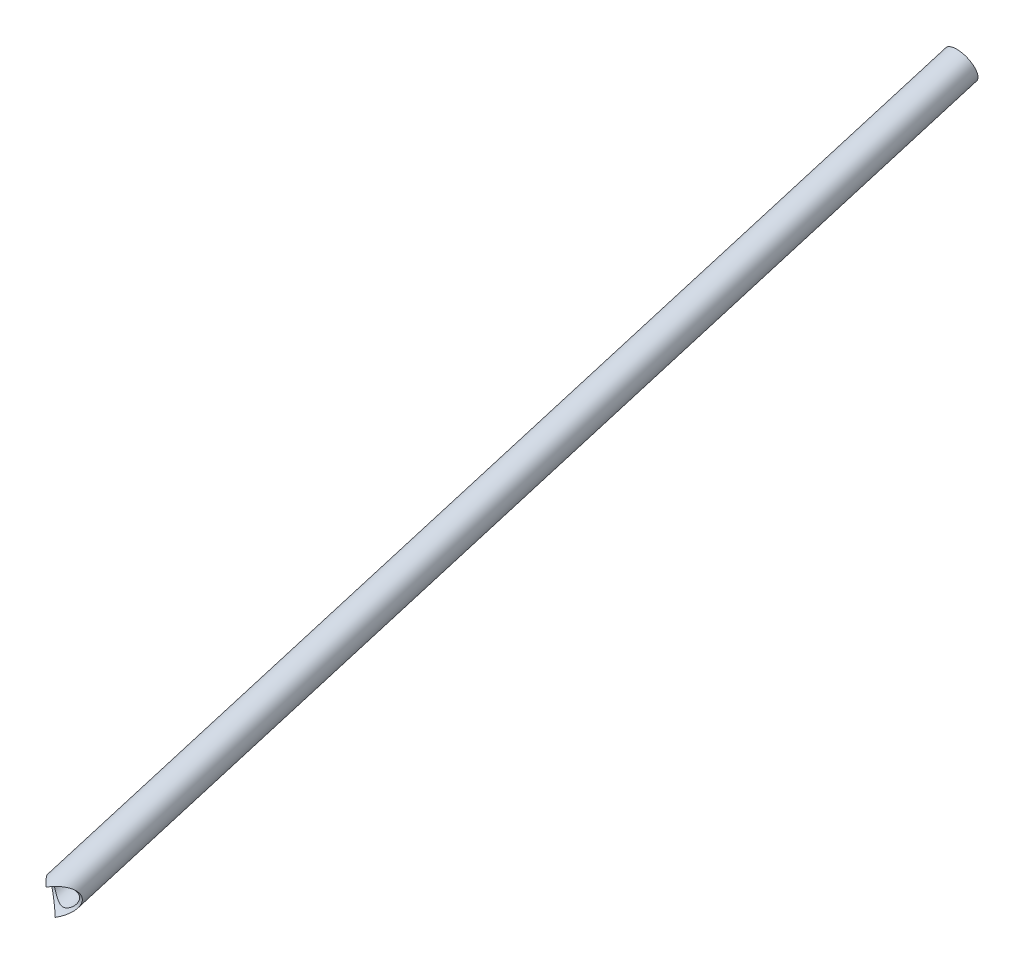
ISO-10303-21;
HEADER;
FILE_DESCRIPTION(('STEP AP214'),'2;1');
FILE_NAME('part.step','',(''),(''),'','','');
FILE_SCHEMA(('AUTOMOTIVE_DESIGN { 1 0 10303 214 1 1 1 1 }'));
ENDSEC;
DATA;
#1=APPLICATION_CONTEXT('core data for automotive mechanical design processes');
#2=APPLICATION_PROTOCOL_DEFINITION('international standard','automotive_design',2000,#1);
#3=PRODUCT_CONTEXT('',#1,'mechanical');
#4=PRODUCT('Part','Part','',(#3));
#5=PRODUCT_RELATED_PRODUCT_CATEGORY('part','',(#4));
#6=PRODUCT_DEFINITION_FORMATION('','',#4);
#7=PRODUCT_DEFINITION_CONTEXT('part definition',#1,'design');
#8=PRODUCT_DEFINITION('design','',#6,#7);
#9=PRODUCT_DEFINITION_SHAPE('','',#8);
#10=(LENGTH_UNIT() NAMED_UNIT(*) SI_UNIT(.MILLI.,.METRE.));
#11=(NAMED_UNIT(*) PLANE_ANGLE_UNIT() SI_UNIT($,.RADIAN.));
#12=(NAMED_UNIT(*) SI_UNIT($,.STERADIAN.) SOLID_ANGLE_UNIT());
#13=UNCERTAINTY_MEASURE_WITH_UNIT(LENGTH_MEASURE(1.E-05),#10,'distance_accuracy_value','');
#14=(GEOMETRIC_REPRESENTATION_CONTEXT(3) GLOBAL_UNCERTAINTY_ASSIGNED_CONTEXT((#13)) GLOBAL_UNIT_ASSIGNED_CONTEXT((#10,
#11,#12)) REPRESENTATION_CONTEXT('',''));
#15=CARTESIAN_POINT('',(0.,0.,0.));
#16=DIRECTION('',(0.,0.,1.));
#17=DIRECTION('',(1.,0.,0.));
#18=AXIS2_PLACEMENT_3D('',#15,#16,#17);
#19=CARTESIAN_POINT('',(0.,380.,-601.037933611912));
#20=DIRECTION('',(0.,0.28459115578957,-0.958648983750756));
#21=DIRECTION('',(0.,0.958648983750756,0.28459115578957));
#22=AXIS2_PLACEMENT_3D('',#19,#20,#21);
#23=CYLINDRICAL_SURFACE('',#22,7.9);
#24=CARTESIAN_POINT('',(0.,540.,-1140.));
#25=DIRECTION('',(0.,-0.28459115578957,0.958648983750756));
#26=DIRECTION('',(1.,0.,0.));
#27=AXIS2_PLACEMENT_3D('',#24,#25,#26);
#28=CIRCLE('',#27,7.9);
#29=CARTESIAN_POINT('',(7.90000000000003,540.,-1140.));
#30=VERTEX_POINT('',#29);
#31=EDGE_CURVE('E78',#30,#30,#28,.T.);
#32=ORIENTED_EDGE('',*,*,#31,.F.);
#33=EDGE_LOOP('',(#32));
#34=FACE_BOUND('',#33,.T.);
#35=CARTESIAN_POINT('',(0.,389.074933040662,-603.847842917835));
#36=CARTESIAN_POINT('',(-0.140198705166132,389.074933218041,-603.847840771808));
#37=CARTESIAN_POINT('',(-0.280388340726457,389.072944604983,-603.854288645852));
#38=CARTESIAN_POINT('',(-0.559491933208422,389.065003416711,-603.879744498527));
#39=CARTESIAN_POINT('',(-0.698405940657576,389.059050999195,-603.898751977478));
#40=CARTESIAN_POINT('',(-0.9742319801172,389.043192715734,-603.948490511685));
#41=CARTESIAN_POINT('',(-1.1111379818681,389.033276775466,-603.979251432512));
#42=CARTESIAN_POINT('',(-1.38184415750912,389.009524129343,-604.051222035313));
#43=CARTESIAN_POINT('',(-1.5156431382016,388.995685943302,-604.092435661333));
#44=CARTESIAN_POINT('',(-1.83055904233549,388.95801991669,-604.20153320174));
#45=CARTESIAN_POINT('',(-2.01002233988592,388.932397692391,-604.273572757181));
#46=CARTESIAN_POINT('',(-2.36153905933224,388.87366368223,-604.431334994707));
#47=CARTESIAN_POINT('',(-2.53358898873316,388.840548411283,-604.517064038422));
#48=CARTESIAN_POINT('',(-2.87071277700848,388.766650362223,-604.699289961532));
#49=CARTESIAN_POINT('',(-3.03576783451177,388.725848348891,-604.795813601485));
#50=CARTESIAN_POINT('',(-3.35865952772203,388.636475624816,-604.996899236841));
#51=CARTESIAN_POINT('',(-3.51649641276467,388.587905182676,-605.101460954251));
#52=CARTESIAN_POINT('',(-3.89326619557405,388.459604327928,-605.363993335558));
#53=CARTESIAN_POINT('',(-4.10849126450114,388.375571661216,-605.525204480512));
#54=CARTESIAN_POINT('',(-4.52507639374604,388.190086518303,-605.855444803985));
#55=CARTESIAN_POINT('',(-4.72643053660203,388.088626671201,-606.024477268372));
#56=CARTESIAN_POINT('',(-5.11493700864665,387.867496577179,-606.366530812169));
#57=CARTESIAN_POINT('',(-5.30210118205758,387.747841773865,-606.539548404373));
#58=CARTESIAN_POINT('',(-5.66167374437891,387.489378701131,-606.886521998578));
#59=CARTESIAN_POINT('',(-5.83408766897071,387.350577668721,-607.060477622257));
#60=CARTESIAN_POINT('',(-6.12818251694021,387.084449257497,-607.36983467366));
#61=CARTESIAN_POINT('',(-6.25288575762627,386.960893963894,-607.505616388007));
#62=CARTESIAN_POINT('',(-6.49148732020402,386.701057984607,-607.774457323246));
#63=CARTESIAN_POINT('',(-6.60538784055275,386.564779899384,-607.907517093738));
#64=CARTESIAN_POINT('',(-6.82121925179064,386.279506330972,-608.169218366054));
#65=CARTESIAN_POINT('',(-6.92316492074691,386.130526950758,-608.29786518071));
#66=CARTESIAN_POINT('',(-7.11403361083094,385.81978304625,-608.549260993654));
#67=CARTESIAN_POINT('',(-7.20295898327905,385.658020838537,-608.672011054133));
#68=CARTESIAN_POINT('',(-7.35239681898775,385.351043828774,-608.889389631069));
#69=CARTESIAN_POINT('',(-7.41516511272451,385.207775965109,-608.985220900528));
#70=CARTESIAN_POINT('',(-7.53012562345858,384.913193417059,-609.170633225379));
#71=CARTESIAN_POINT('',(-7.58231997250967,384.761880362632,-609.260215538371));
#72=CARTESIAN_POINT('',(-7.6754079172861,384.45188301025,-609.432106317085));
#73=CARTESIAN_POINT('',(-7.71630532585937,384.293201220503,-609.514417230593));
#74=CARTESIAN_POINT('',(-7.78619269743311,383.969290264683,-609.670840235354));
#75=CARTESIAN_POINT('',(-7.81518252312598,383.804061023135,-609.744952232057));
#76=CARTESIAN_POINT('',(-7.86086179509572,383.467448146822,-609.884409086844));
#77=CARTESIAN_POINT('',(-7.87749895930503,383.296041536809,-609.949715733945));
#78=CARTESIAN_POINT('',(-7.89797323859593,382.949040073782,-610.070480835862));
#79=CARTESIAN_POINT('',(-7.90181032698043,382.773445212033,-610.125939270138));
#80=CARTESIAN_POINT('',(-7.8966140832068,382.419512333479,-610.226502904453));
#81=CARTESIAN_POINT('',(-7.88758124894792,382.241174423058,-610.271608504933));
#82=CARTESIAN_POINT('',(-7.85681088207582,381.883240486664,-610.351204603661));
#83=CARTESIAN_POINT('',(-7.83507377871531,381.703644503401,-610.3856954605));
#84=CARTESIAN_POINT('',(-7.78114606022274,381.356655625464,-610.442097241651));
#85=CARTESIAN_POINT('',(-7.74975082382369,381.189249042516,-610.464694651477));
#86=CARTESIAN_POINT('',(-7.67667179046085,380.855655994073,-610.500808974226));
#87=CARTESIAN_POINT('',(-7.63498452249852,380.689469959721,-610.514322817972));
#88=CARTESIAN_POINT('',(-7.54188327999775,380.35940664029,-610.532571206728));
#89=CARTESIAN_POINT('',(-7.49047131361981,380.195528886043,-610.537307562123));
#90=CARTESIAN_POINT('',(-7.37849967418185,379.870848456446,-610.538443715513));
#91=CARTESIAN_POINT('',(-7.31793649158187,379.710046987638,-610.534840307541));
#92=CARTESIAN_POINT('',(-7.18271553524371,379.378624058127,-610.519163412687));
#93=CARTESIAN_POINT('',(-7.10729357629148,379.208347247821,-610.506388201741));
#94=CARTESIAN_POINT('',(-6.94718292382085,378.873068288921,-610.472363291057));
#95=CARTESIAN_POINT('',(-6.86249100159566,378.708068004149,-610.451110631785));
#96=CARTESIAN_POINT('',(-6.59559781102728,378.221893275001,-610.375798214059));
#97=CARTESIAN_POINT('',(-6.40051451646308,377.909388684674,-610.310175306684));
#98=CARTESIAN_POINT('',(-6.06437493065132,377.430032331717,-610.185620814191));
#99=CARTESIAN_POINT('',(-5.93249725847849,377.254488646048,-610.13432168274));
#100=CARTESIAN_POINT('',(-5.65883825862776,376.913684999871,-610.02440486656));
#101=CARTESIAN_POINT('',(-5.51705776702701,376.748424173423,-609.965787799344));
#102=CARTESIAN_POINT('',(-5.22393976465587,376.428435122373,-609.842669509363));
#103=CARTESIAN_POINT('',(-5.07258685943922,376.273724740336,-609.778158730212));
#104=CARTESIAN_POINT('',(-4.7608570794348,375.975627098827,-609.644969173335));
#105=CARTESIAN_POINT('',(-4.60048081212769,375.832239078656,-609.576290676168));
#106=CARTESIAN_POINT('',(-4.26879305155578,375.55574530154,-609.435726943311));
#107=CARTESIAN_POINT('',(-4.09737334894962,375.422783736193,-609.363813098693));
#108=CARTESIAN_POINT('',(-3.74516170717446,375.16993284473,-609.219719577483));
#109=CARTESIAN_POINT('',(-3.56436747522876,375.050046739007,-609.147539839908));
#110=CARTESIAN_POINT('',(-3.19337181317182,374.824838558278,-609.005704419572));
#111=CARTESIAN_POINT('',(-3.00318690795805,374.719492056531,-608.936044652205));
#112=CARTESIAN_POINT('',(-2.61290530262902,374.525026216027,-608.802504744946));
#113=CARTESIAN_POINT('',(-2.41281528580764,374.435896120375,-608.738620788017));
#114=CARTESIAN_POINT('',(-1.95639898131742,374.258459690222,-608.607574005229));
#115=CARTESIAN_POINT('',(-1.69747434733742,374.174759641194,-608.542850810268));
#116=CARTESIAN_POINT('',(-1.29944939706605,374.074753389387,-608.463784839389));
#117=CARTESIAN_POINT('',(-1.16526918497823,374.045687155952,-608.440443097719));
#118=CARTESIAN_POINT('',(-0.894241109357024,373.996759247914,-608.400819888454));
#119=CARTESIAN_POINT('',(-0.757394675082758,373.976892775854,-608.384534741298));
#120=CARTESIAN_POINT('',(-0.480501039363062,373.946817347031,-608.359775582632));
#121=CARTESIAN_POINT('',(-0.3404354203518,373.936709143083,-608.351383084072));
#122=CARTESIAN_POINT('',(-0.059688885967576,373.926864813291,-608.343210586807));
#123=CARTESIAN_POINT('',(0.0809919953120438,373.927128119836,-608.343430116784));
#124=CARTESIAN_POINT('',(0.361770200254796,373.938020724719,-608.352470876916));
#125=CARTESIAN_POINT('',(0.501867020233609,373.948657625784,-608.361298415814));
#126=CARTESIAN_POINT('',(0.780185241006483,373.979928869618,-608.387025181005));
#127=CARTESIAN_POINT('',(0.918406351387906,374.000564742757,-608.403925642874));
#128=CARTESIAN_POINT('',(1.21487363601642,374.055416507762,-608.448289064076));
#129=CARTESIAN_POINT('',(1.37261154579278,374.091324134827,-608.477044171941));
#130=CARTESIAN_POINT('',(1.68339925929195,374.174654995244,-608.542475692007));
#131=CARTESIAN_POINT('',(1.83644528097903,374.222087257061,-608.579158312167));
#132=CARTESIAN_POINT('',(2.13771707801443,374.327351297106,-608.658656100869));
#133=CARTESIAN_POINT('',(2.28592904549343,374.385210227871,-608.701487220293));
#134=CARTESIAN_POINT('',(2.57697398913313,374.510131264116,-608.791466610002));
#135=CARTESIAN_POINT('',(2.7198082467326,374.577191159211,-608.838613842505));
#136=CARTESIAN_POINT('',(3.08204037383424,374.761174299923,-608.964046847896));
#137=CARTESIAN_POINT('',(3.29752530331886,374.884374412677,-609.044461105118));
#138=CARTESIAN_POINT('',(3.71607497425997,375.149071657939,-609.207555315283));
#139=CARTESIAN_POINT('',(3.91913278510158,375.290578865791,-609.290236495936));
#140=CARTESIAN_POINT('',(4.31346966621354,375.590376724835,-609.454254820082));
#141=CARTESIAN_POINT('',(4.50473340408777,375.748688524052,-609.535590117491));
#142=CARTESIAN_POINT('',(4.87523576964812,376.080775836742,-609.693770842944));
#143=CARTESIAN_POINT('',(5.05447675654683,376.254548300721,-609.770617151473));
#144=CARTESIAN_POINT('',(5.40715910714218,376.623590018492,-609.919992213498));
#145=CARTESIAN_POINT('',(5.58012784480535,376.819422383753,-609.992249379096));
#146=CARTESIAN_POINT('',(5.91194645909232,377.22611704483,-610.126466824592));
#147=CARTESIAN_POINT('',(6.07079392191931,377.436981899144,-610.188425345677));
#148=CARTESIAN_POINT('',(6.37260703914589,377.872287480164,-610.299314312737));
#149=CARTESIAN_POINT('',(6.51560987386365,378.096694430515,-610.348275651478));
#150=CARTESIAN_POINT('',(6.78432413306596,378.558296722445,-610.430824337466));
#151=CARTESIAN_POINT('',(6.91004381567741,378.795485880564,-610.464419045083));
#152=CARTESIAN_POINT('',(7.10741180804384,379.208464233181,-610.506449244164));
#153=CARTESIAN_POINT('',(7.18399982577244,379.381452236271,-610.519401078825));
#154=CARTESIAN_POINT('',(7.32679366399491,379.732085566573,-610.535775531372));
#155=CARTESIAN_POINT('',(7.39300216803337,379.909729676075,-610.539200616174));
#156=CARTESIAN_POINT('',(7.51418711651106,380.268638604006,-610.535829346237));
#157=CARTESIAN_POINT('',(7.56916881268894,380.449901685769,-610.529037783196));
#158=CARTESIAN_POINT('',(7.66714123466574,380.814953000383,-610.504681181338));
#159=CARTESIAN_POINT('',(7.71013165615633,380.998741297193,-610.487115869147));
#160=CARTESIAN_POINT('',(7.78363892935899,381.368592335531,-610.440693766642));
#161=CARTESIAN_POINT('',(7.81407756665054,381.554662113412,-610.411768303763));
#162=CARTESIAN_POINT('',(7.86154601615557,381.926395891105,-610.342488442964));
#163=CARTESIAN_POINT('',(7.87857584876234,382.112059891534,-610.302134062427));
#164=CARTESIAN_POINT('',(7.89889629122488,382.48128921549,-610.210141271286));
#165=CARTESIAN_POINT('',(7.90219021289689,382.664855034256,-610.158505583837));
#166=CARTESIAN_POINT('',(7.89498147442728,383.028288621583,-610.044361262506));
#167=CARTESIAN_POINT('',(7.88447974020794,383.208156637506,-609.981853358578));
#168=CARTESIAN_POINT('',(7.85152035750269,383.545968552823,-609.853014639682));
#169=CARTESIAN_POINT('',(7.83028096818358,383.704382628863,-609.787597298784));
#170=CARTESIAN_POINT('',(7.7769750539491,384.015979359786,-609.649030587133));
#171=CARTESIAN_POINT('',(7.74490488001004,384.169160232361,-609.575878616202));
#172=CARTESIAN_POINT('',(7.67041072764324,384.469350480238,-609.422640074572));
#173=CARTESIAN_POINT('',(7.62798923978154,384.616361330115,-609.342555174947));
#174=CARTESIAN_POINT('',(7.53333220847789,384.903643164827,-609.176228895528));
#175=CARTESIAN_POINT('',(7.48109296045802,385.04391158034,-609.089985199449));
#176=CARTESIAN_POINT('',(7.36477238200529,385.323540255814,-608.908067779116));
#177=CARTESIAN_POINT('',(7.30025295815983,385.462554209419,-608.812141960337));
#178=CARTESIAN_POINT('',(7.16186299031143,385.73228539677,-608.615453707671));
#179=CARTESIAN_POINT('',(7.08798878828734,385.862999354766,-608.514689391396));
#180=CARTESIAN_POINT('',(6.85342018659262,386.24230219467,-608.2065865717));
#181=CARTESIAN_POINT('',(6.67970134284627,386.478236947032,-607.993315914391));
#182=CARTESIAN_POINT('',(6.35307996166275,386.857565932876,-607.616322824556));
#183=CARTESIAN_POINT('',(6.20692698135851,387.008884426761,-607.454506319531));
#184=CARTESIAN_POINT('',(5.90018918722458,387.293766009044,-607.128726353079));
#185=CARTESIAN_POINT('',(5.7395986237704,387.427321970725,-606.96476205872));
#186=CARTESIAN_POINT('',(5.40452485119789,387.677726878949,-606.63662034108));
#187=CARTESIAN_POINT('',(5.22998849476713,387.794506654396,-606.472444701473));
#188=CARTESIAN_POINT('',(4.86828371349067,388.011488131863,-606.147166109279));
#189=CARTESIAN_POINT('',(4.68111730010899,388.111692464959,-605.986062672629));
#190=CARTESIAN_POINT('',(4.29088393944386,388.297963465329,-605.667027652428));
#191=CARTESIAN_POINT('',(4.08759285149947,388.383745940983,-605.509203970758));
#192=CARTESIAN_POINT('',(3.66772388143031,388.539750830442,-605.20351783156));
#193=CARTESIAN_POINT('',(3.45113915551896,388.609965142238,-605.055660588508));
#194=CARTESIAN_POINT('',(3.00519187899097,388.735104474534,-604.77575694939));
#195=CARTESIAN_POINT('',(2.77589368201305,388.790099322926,-604.643639982492));
#196=CARTESIAN_POINT('',(2.3031255750877,388.885589297049,-604.401447558878));
#197=CARTESIAN_POINT('',(2.0596754660497,388.926104140833,-604.291342218755));
#198=CARTESIAN_POINT('',(1.66540010195322,388.978643014687,-604.142338762551));
#199=CARTESIAN_POINT('',(1.51912000469924,388.995460887795,-604.093053142797));
#200=CARTESIAN_POINT('',(1.22256884013636,389.024327525182,-604.006701992726));
#201=CARTESIAN_POINT('',(1.07230014317832,389.036379057168,-603.969629372689));
#202=CARTESIAN_POINT('',(0.769192625451235,389.055643098638,-603.909576049526));
#203=CARTESIAN_POINT('',(0.616364889895456,389.062872722936,-603.886545530817));
#204=CARTESIAN_POINT('',(0.309020942180122,389.072517267345,-603.85568118547));
#205=CARTESIAN_POINT('',(0.154504963580209,389.074932845182,-603.847845282848));
#206=CARTESIAN_POINT('',(0.,389.074933040662,-603.847842917835));
#207=B_SPLINE_CURVE_WITH_KNOTS('',3,(#35,#36,#37,#38,#39,#40,#41,#42,#43,#44,#45,#46,#47,#48,
#49,#50,#51,#52,#53,#54,#55,#56,#57,#58,#59,#60,#61,#62,#63,#64,#65,#66,#67,#68,#69,#70,#71,#72,
#73,#74,#75,#76,#77,#78,#79,#80,#81,#82,#83,#84,#85,#86,#87,#88,#89,#90,#91,#92,#93,#94,#95,#96,
#97,#98,#99,#100,#101,#102,#103,#104,#105,#106,#107,#108,#109,#110,#111,#112,#113,#114,#115,
#116,#117,#118,#119,#120,#121,#122,#123,#124,#125,#126,#127,#128,#129,#130,#131,#132,#133,#134,
#135,#136,#137,#138,#139,#140,#141,#142,#143,#144,#145,#146,#147,#148,#149,#150,#151,#152,#153,
#154,#155,#156,#157,#158,#159,#160,#161,#162,#163,#164,#165,#166,#167,#168,#169,#170,#171,#172,
#173,#174,#175,#176,#177,#178,#179,#180,#181,#182,#183,#184,#185,#186,#187,#188,#189,#190,#191,
#192,#193,#194,#195,#196,#197,#198,#199,#200,#201,#202,#203,#204,#205,#206),.UNSPECIFIED.,.T.,
.F.,(4,2,2,2,2,2,2,2,2,2,2,2,2,2,2,2,2,2,2,2,2,2,2,2,2,2,2,2,2,2,2,2,2,2,2,2,2,2,2,2,2,2,2,2,2,
2,2,2,2,2,2,2,2,2,2,2,2,2,2,2,2,2,2,2,2,2,2,2,2,2,2,2,2,2,2,2,2,2,2,2,2,2,2,2,2,4),(0.,
0.420422644221081,0.840828563078375,1.26230991769994,1.68395054407759,2.2682150880726,
2.85275193954753,3.43877144102906,4.0247706844597,4.86885683853888,5.71330088550013,
6.55703214106825,7.40044534735712,8.06565744961555,8.73073388304438,9.39497931244493,
10.0591046381851,10.6088727928329,11.1585299856324,11.708001435471,12.2574792211448,
12.8092695921967,13.3610611141164,13.9128312894336,14.4645828225802,14.9794737194551,
15.4945385016051,16.0094970382204,16.5246535677704,17.0841101518648,17.6437622172095,
18.7625627868241,19.438528513632,20.1144372386994,20.7914620581085,21.4684413525229,
22.1535521208672,22.8388312479633,23.5229447054748,24.206602699506,25.0425518298785,
25.4599196083723,25.8770694936667,26.2984817383093,26.7198709199795,27.1415691668035,
27.5633319761011,28.0554904591205,28.5480357522368,29.0418827430846,29.5356113020346,
30.317193118342,31.0992069242547,31.8822168060316,32.6650725863143,33.477410678997,
34.2898873614272,35.100415231553,35.9105544641997,36.4789177233218,37.0471337932249,
37.6150834478261,38.1830475142473,38.7544991412862,39.325949899209,39.8972628687193,
40.4685374954083,40.9860462913749,41.5037296166048,42.0212885078354,42.5390430853351,
43.0809022422464,43.622973941735,44.7064183002555,45.5017414619468,46.2973827682127,
47.0962158658932,47.8949220402362,48.7078809235212,49.5212619002777,50.3308467113378,
51.139324836877,51.6046420087094,52.0696885831412,52.5330756164059,52.9963993343868),.UNSPECIFIED.);
#208=CARTESIAN_POINT('',(0.,389.074933040662,-603.847842917835));
#209=VERTEX_POINT('',#208);
#210=EDGE_CURVE('E81',#209,#209,#207,.T.);
#211=ORIENTED_EDGE('',*,*,#210,.T.);
#212=EDGE_LOOP('',(#211));
#213=FACE_BOUND('',#212,.T.);
#214=ADVANCED_FACE('F39',(#34,#213),#23,.F.);
#215=CARTESIAN_POINT('',(0.,540.,-1140.));
#216=DIRECTION('',(0.,-0.28459115578957,0.958648983750756));
#217=DIRECTION('',(1.,0.,0.));
#218=AXIS2_PLACEMENT_3D('',#215,#216,#217);
#219=PLANE('',#218);
#220=ORIENTED_EDGE('',*,*,#31,.T.);
#221=EDGE_LOOP('',(#220));
#222=FACE_BOUND('',#221,.T.);
#223=CARTESIAN_POINT('',(0.,540.,-1140.));
#224=DIRECTION('',(0.,-0.28459115578957,0.958648983750756));
#225=DIRECTION('',(1.,0.,0.));
#226=AXIS2_PLACEMENT_3D('',#223,#224,#225);
#227=CIRCLE('',#226,9.5);
#228=CARTESIAN_POINT('',(9.50000000000003,540.,-1140.));
#229=VERTEX_POINT('',#228);
#230=EDGE_CURVE('E55',#229,#229,#227,.T.);
#231=ORIENTED_EDGE('',*,*,#230,.F.);
#232=EDGE_LOOP('',(#231));
#233=FACE_BOUND('',#232,.T.);
#234=ADVANCED_FACE('F58',(#222,#233),#219,.F.);
#235=CARTESIAN_POINT('',(0.,380.,-601.037933611912));
#236=DIRECTION('',(0.,0.28459115578957,-0.958648983750756));
#237=DIRECTION('',(0.,0.958648983750756,0.28459115578957));
#238=AXIS2_PLACEMENT_3D('',#235,#236,#237);
#239=CYLINDRICAL_SURFACE('',#238,9.5);
#240=ORIENTED_EDGE('',*,*,#230,.T.);
#241=EDGE_LOOP('',(#240));
#242=FACE_BOUND('',#241,.T.);
#243=CARTESIAN_POINT('',(0.,380.,-601.037933611912));
#244=DIRECTION('',(-0.707106781186547,0.201236336124522,-0.677867197187752));
#245=DIRECTION('',(0.707106781186547,0.201236336124522,-0.677867197187752));
#246=AXIS2_PLACEMENT_3D('',#243,#244,#245);
#247=ELLIPSE('',#246,13.4350288425444,9.5);
#248=CARTESIAN_POINT('',(0.,370.892834654368,-603.741549591913));
#249=VERTEX_POINT('',#248);
#250=CARTESIAN_POINT('',(0.,389.107165345632,-598.334317631911));
#251=VERTEX_POINT('',#250);
#252=EDGE_CURVE('E11',#249,#251,#247,.F.);
#253=ORIENTED_EDGE('',*,*,#252,.F.);
#254=CARTESIAN_POINT('',(0.,380.,-601.037933611912));
#255=DIRECTION('',(0.707106781186547,0.201236336124522,-0.677867197187752));
#256=DIRECTION('',(-0.707106781186547,0.201236336124522,-0.677867197187752));
#257=AXIS2_PLACEMENT_3D('',#254,#255,#256);
#258=ELLIPSE('',#257,13.4350288425444,9.5);
#259=EDGE_CURVE('E47',#251,#249,#258,.F.);
#260=ORIENTED_EDGE('',*,*,#259,.F.);
#261=EDGE_LOOP('',(#253,#260));
#262=FACE_BOUND('',#261,.T.);
#263=ADVANCED_FACE('F56',(#242,#262),#239,.T.);
#264=CARTESIAN_POINT('',(80.,380.,-601.037933611912));
#265=DIRECTION('',(-1.,0.,0.));
#266=DIRECTION('',(0.,0.,1.));
#267=AXIS2_PLACEMENT_3D('',#264,#265,#266);
#268=CYLINDRICAL_SURFACE('',#267,9.5);
#269=ORIENTED_EDGE('',*,*,#210,.F.);
#270=EDGE_LOOP('',(#269));
#271=FACE_BOUND('',#270,.T.);
#272=ORIENTED_EDGE('',*,*,#252,.T.);
#273=ORIENTED_EDGE('',*,*,#259,.T.);
#274=EDGE_LOOP('',(#272,#273));
#275=FACE_BOUND('',#274,.T.);
#276=ADVANCED_FACE('F53',(#271,#275),#268,.F.);
#277=CLOSED_SHELL('',(#214,#234,#263,#276));
#278=MANIFOLD_SOLID_BREP('B2',#277);
#279=ADVANCED_BREP_SHAPE_REPRESENTATION('',(#18,#278),#14);
#280=SHAPE_DEFINITION_REPRESENTATION(#9,#279);
ENDSEC;
END-ISO-10303-21;
